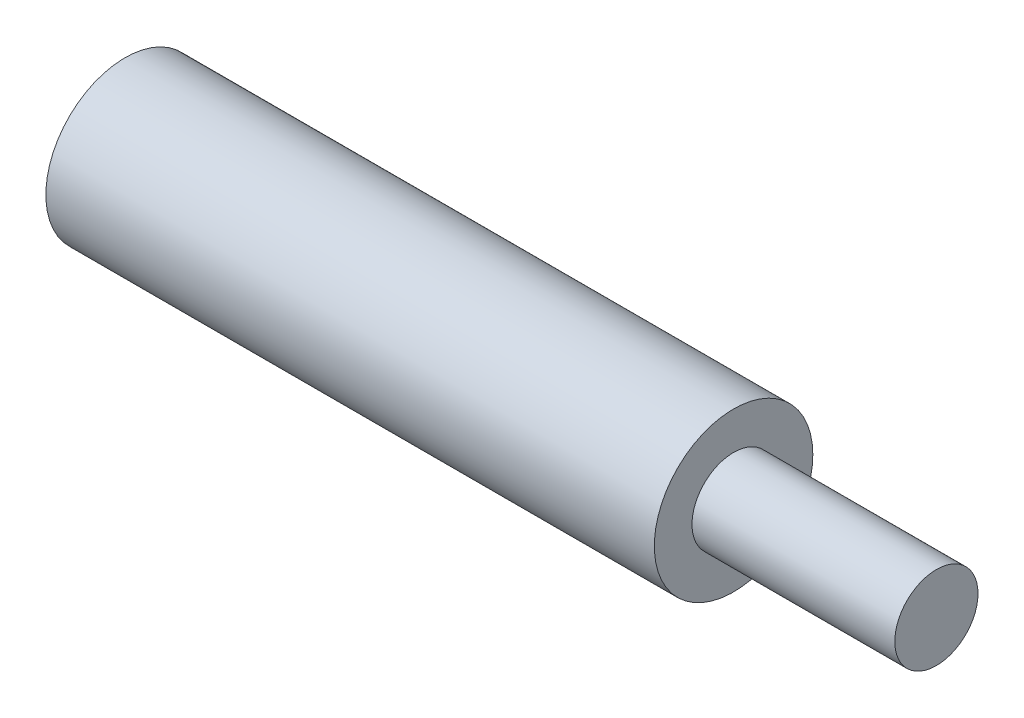
ISO-10303-21;
HEADER;
FILE_DESCRIPTION(('STEP AP214'),'2;1');
FILE_NAME('part.step','',(''),(''),'','','');
FILE_SCHEMA(('AUTOMOTIVE_DESIGN { 1 0 10303 214 1 1 1 1 }'));
ENDSEC;
DATA;
#1=APPLICATION_CONTEXT('core data for automotive mechanical design processes');
#2=APPLICATION_PROTOCOL_DEFINITION('international standard','automotive_design',2000,#1);
#3=PRODUCT_CONTEXT('',#1,'mechanical');
#4=PRODUCT('Part','Part','',(#3));
#5=PRODUCT_RELATED_PRODUCT_CATEGORY('part','',(#4));
#6=PRODUCT_DEFINITION_FORMATION('','',#4);
#7=PRODUCT_DEFINITION_CONTEXT('part definition',#1,'design');
#8=PRODUCT_DEFINITION('design','',#6,#7);
#9=PRODUCT_DEFINITION_SHAPE('','',#8);
#10=(LENGTH_UNIT() NAMED_UNIT(*) SI_UNIT(.MILLI.,.METRE.));
#11=(NAMED_UNIT(*) PLANE_ANGLE_UNIT() SI_UNIT($,.RADIAN.));
#12=(NAMED_UNIT(*) SI_UNIT($,.STERADIAN.) SOLID_ANGLE_UNIT());
#13=UNCERTAINTY_MEASURE_WITH_UNIT(LENGTH_MEASURE(1.E-05),#10,'distance_accuracy_value','');
#14=(GEOMETRIC_REPRESENTATION_CONTEXT(3) GLOBAL_UNCERTAINTY_ASSIGNED_CONTEXT((#13)) GLOBAL_UNIT_ASSIGNED_CONTEXT((#10,
#11,#12)) REPRESENTATION_CONTEXT('',''));
#15=CARTESIAN_POINT('',(0.,0.,0.));
#16=DIRECTION('',(0.,0.,1.));
#17=DIRECTION('',(1.,0.,0.));
#18=AXIS2_PLACEMENT_3D('',#15,#16,#17);
#19=CARTESIAN_POINT('',(390.,0.,0.));
#20=DIRECTION('',(-1.,0.,0.));
#21=DIRECTION('',(0.,0.,1.));
#22=AXIS2_PLACEMENT_3D('',#19,#20,#21);
#23=CYLINDRICAL_SURFACE('',#22,20.);
#24=CARTESIAN_POINT('',(292.5,0.,0.));
#25=DIRECTION('',(1.,0.,0.));
#26=DIRECTION('',(0.,0.,-1.));
#27=AXIS2_PLACEMENT_3D('',#24,#25,#26);
#28=CIRCLE('',#27,20.);
#29=CARTESIAN_POINT('',(292.5,0.,-20.));
#30=VERTEX_POINT('',#29);
#31=EDGE_CURVE('E40',#30,#30,#28,.T.);
#32=ORIENTED_EDGE('',*,*,#31,.T.);
#33=EDGE_LOOP('',(#32));
#34=FACE_BOUND('',#33,.T.);
#35=CARTESIAN_POINT('',(390.,0.,0.));
#36=DIRECTION('',(1.,0.,0.));
#37=DIRECTION('',(0.,0.,-1.));
#38=AXIS2_PLACEMENT_3D('',#35,#36,#37);
#39=CIRCLE('',#38,20.);
#40=CARTESIAN_POINT('',(390.,0.,-20.));
#41=VERTEX_POINT('',#40);
#42=EDGE_CURVE('E10',#41,#41,#39,.T.);
#43=ORIENTED_EDGE('',*,*,#42,.F.);
#44=EDGE_LOOP('',(#43));
#45=FACE_BOUND('',#44,.T.);
#46=ADVANCED_FACE('F37',(#34,#45),#23,.T.);
#47=CARTESIAN_POINT('',(390.,0.,0.));
#48=DIRECTION('',(1.,0.,0.));
#49=DIRECTION('',(0.,0.,-1.));
#50=AXIS2_PLACEMENT_3D('',#47,#48,#49);
#51=PLANE('',#50);
#52=ORIENTED_EDGE('',*,*,#42,.T.);
#53=EDGE_LOOP('',(#52));
#54=FACE_BOUND('',#53,.T.);
#55=ADVANCED_FACE('F64',(#54),#51,.T.);
#56=CARTESIAN_POINT('',(292.5,0.,0.));
#57=DIRECTION('',(-1.,0.,0.));
#58=DIRECTION('',(0.,0.,1.));
#59=AXIS2_PLACEMENT_3D('',#56,#57,#58);
#60=CYLINDRICAL_SURFACE('',#59,38.1);
#61=CARTESIAN_POINT('',(292.5,0.,0.));
#62=DIRECTION('',(1.,0.,0.));
#63=DIRECTION('',(0.,0.,-1.));
#64=AXIS2_PLACEMENT_3D('',#61,#62,#63);
#65=CIRCLE('',#64,38.1);
#66=CARTESIAN_POINT('',(292.5,0.,-38.1));
#67=VERTEX_POINT('',#66);
#68=EDGE_CURVE('E49',#67,#67,#65,.T.);
#69=ORIENTED_EDGE('',*,*,#68,.F.);
#70=EDGE_LOOP('',(#69));
#71=FACE_BOUND('',#70,.T.);
#72=CARTESIAN_POINT('',(0.,0.,0.));
#73=DIRECTION('',(1.,0.,0.));
#74=DIRECTION('',(0.,0.,-1.));
#75=AXIS2_PLACEMENT_3D('',#72,#73,#74);
#76=CIRCLE('',#75,38.1);
#77=CARTESIAN_POINT('',(0.,0.,-38.1));
#78=VERTEX_POINT('',#77);
#79=EDGE_CURVE('E51',#78,#78,#76,.T.);
#80=ORIENTED_EDGE('',*,*,#79,.T.);
#81=EDGE_LOOP('',(#80));
#82=FACE_BOUND('',#81,.T.);
#83=ADVANCED_FACE('F61',(#71,#82),#60,.T.);
#84=CARTESIAN_POINT('',(292.5,0.,0.));
#85=DIRECTION('',(1.,0.,0.));
#86=DIRECTION('',(0.,0.,-1.));
#87=AXIS2_PLACEMENT_3D('',#84,#85,#86);
#88=PLANE('',#87);
#89=ORIENTED_EDGE('',*,*,#31,.F.);
#90=EDGE_LOOP('',(#89));
#91=FACE_BOUND('',#90,.T.);
#92=ORIENTED_EDGE('',*,*,#68,.T.);
#93=EDGE_LOOP('',(#92));
#94=FACE_BOUND('',#93,.T.);
#95=ADVANCED_FACE('F59',(#91,#94),#88,.T.);
#96=CARTESIAN_POINT('',(0.,0.,0.));
#97=DIRECTION('',(1.,0.,0.));
#98=DIRECTION('',(0.,0.,-1.));
#99=AXIS2_PLACEMENT_3D('',#96,#97,#98);
#100=PLANE('',#99);
#101=ORIENTED_EDGE('',*,*,#79,.F.);
#102=EDGE_LOOP('',(#101));
#103=FACE_BOUND('',#102,.T.);
#104=ADVANCED_FACE('F68',(#103),#100,.F.);
#105=CLOSED_SHELL('',(#46,#55,#83,#95,#104));
#106=MANIFOLD_SOLID_BREP('B2',#105);
#107=ADVANCED_BREP_SHAPE_REPRESENTATION('',(#18,#106),#14);
#108=SHAPE_DEFINITION_REPRESENTATION(#9,#107);
ENDSEC;
END-ISO-10303-21;
